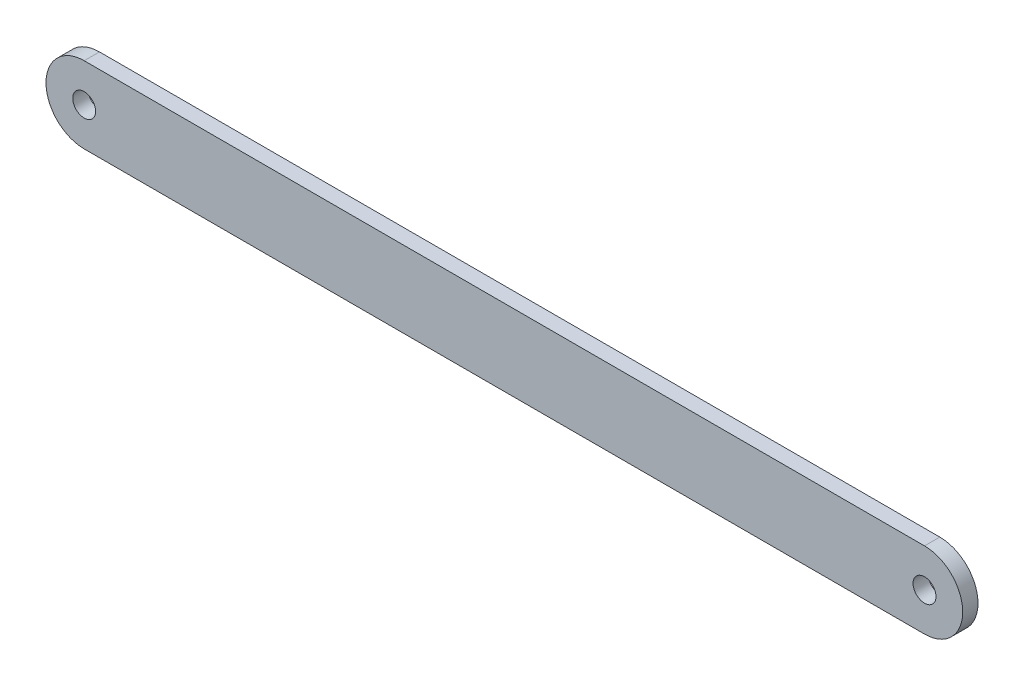
ISO-10303-21;
HEADER;
FILE_DESCRIPTION(('STEP AP214'),'2;1');
FILE_NAME('part.step','',(''),(''),'','','');
FILE_SCHEMA(('AUTOMOTIVE_DESIGN { 1 0 10303 214 1 1 1 1 }'));
ENDSEC;
DATA;
#1=APPLICATION_CONTEXT('core data for automotive mechanical design processes');
#2=APPLICATION_PROTOCOL_DEFINITION('international standard','automotive_design',2000,#1);
#3=PRODUCT_CONTEXT('',#1,'mechanical');
#4=PRODUCT('Part','Part','',(#3));
#5=PRODUCT_RELATED_PRODUCT_CATEGORY('part','',(#4));
#6=PRODUCT_DEFINITION_FORMATION('','',#4);
#7=PRODUCT_DEFINITION_CONTEXT('part definition',#1,'design');
#8=PRODUCT_DEFINITION('design','',#6,#7);
#9=PRODUCT_DEFINITION_SHAPE('','',#8);
#10=(LENGTH_UNIT() NAMED_UNIT(*) SI_UNIT(.MILLI.,.METRE.));
#11=(NAMED_UNIT(*) PLANE_ANGLE_UNIT() SI_UNIT($,.RADIAN.));
#12=(NAMED_UNIT(*) SI_UNIT($,.STERADIAN.) SOLID_ANGLE_UNIT());
#13=UNCERTAINTY_MEASURE_WITH_UNIT(LENGTH_MEASURE(1.E-05),#10,'distance_accuracy_value','');
#14=(GEOMETRIC_REPRESENTATION_CONTEXT(3) GLOBAL_UNCERTAINTY_ASSIGNED_CONTEXT((#13)) GLOBAL_UNIT_ASSIGNED_CONTEXT((#10,
#11,#12)) REPRESENTATION_CONTEXT('',''));
#15=CARTESIAN_POINT('',(0.,0.,0.));
#16=DIRECTION('',(0.,0.,1.));
#17=DIRECTION('',(1.,0.,0.));
#18=AXIS2_PLACEMENT_3D('',#15,#16,#17);
#19=CARTESIAN_POINT('',(9.73390781831E-06,1.23811E-11,2.));
#20=DIRECTION('',(0.,0.,1.));
#21=DIRECTION('',(1.,0.,0.));
#22=AXIS2_PLACEMENT_3D('',#19,#20,#21);
#23=PLANE('',#22);
#24=CARTESIAN_POINT('',(55.000017338002,0.,2.));
#25=DIRECTION('',(0.,0.,1.));
#26=DIRECTION('',(1.,0.,0.));
#27=AXIS2_PLACEMENT_3D('',#24,#25,#26);
#28=CIRCLE('',#27,1.5);
#29=CARTESIAN_POINT('',(56.500017338002,0.,2.));
#30=VERTEX_POINT('',#29);
#31=EDGE_CURVE('E25',#30,#30,#28,.T.);
#32=ORIENTED_EDGE('',*,*,#31,.F.);
#33=EDGE_LOOP('',(#32));
#34=FACE_BOUND('',#33,.T.);
#35=CARTESIAN_POINT('',(-55.,0.,2.));
#36=DIRECTION('',(0.,0.,1.));
#37=DIRECTION('',(1.,0.,0.));
#38=AXIS2_PLACEMENT_3D('',#35,#36,#37);
#39=CIRCLE('',#38,1.5);
#40=CARTESIAN_POINT('',(-53.5,0.,2.));
#41=VERTEX_POINT('',#40);
#42=EDGE_CURVE('E145',#41,#41,#39,.T.);
#43=ORIENTED_EDGE('',*,*,#42,.F.);
#44=EDGE_LOOP('',(#43));
#45=FACE_BOUND('',#44,.T.);
#46=CARTESIAN_POINT('',(55.000017338002,0.,2.));
#47=DIRECTION('',(0.,0.,1.));
#48=DIRECTION('',(1.,0.,0.));
#49=AXIS2_PLACEMENT_3D('',#46,#47,#48);
#50=CIRCLE('',#49,5.);
#51=CARTESIAN_POINT('',(55.000017289727,-4.999999999985,2.));
#52=VERTEX_POINT('',#51);
#53=CARTESIAN_POINT('',(55.000017289718,5.,2.));
#54=VERTEX_POINT('',#53);
#55=EDGE_CURVE('E112',#52,#54,#50,.T.);
#56=ORIENTED_EDGE('',*,*,#55,.T.);
#57=DIRECTION('',(1.,0.,0.));
#58=VECTOR('',#57,1.);
#59=CARTESIAN_POINT('',(-54.99998271028,5.,2.));
#60=LINE('',#59,#58);
#61=CARTESIAN_POINT('',(-54.99998271028,4.999999999985,2.));
#62=VERTEX_POINT('',#61);
#63=EDGE_CURVE('E95',#62,#54,#60,.T.);
#64=ORIENTED_EDGE('',*,*,#63,.F.);
#65=CARTESIAN_POINT('',(-55.,0.,2.));
#66=DIRECTION('',(0.,0.,1.));
#67=DIRECTION('',(1.,0.,0.));
#68=AXIS2_PLACEMENT_3D('',#65,#66,#67);
#69=CIRCLE('',#68,5.);
#70=CARTESIAN_POINT('',(-54.99998271027,-4.99999999997,2.));
#71=VERTEX_POINT('',#70);
#72=EDGE_CURVE('E72',#62,#71,#69,.T.);
#73=ORIENTED_EDGE('',*,*,#72,.T.);
#74=DIRECTION('',(1.,0.,0.));
#75=VECTOR('',#74,1.);
#76=CARTESIAN_POINT('',(-54.99998271027,-4.99999999997,2.));
#77=LINE('',#76,#75);
#78=EDGE_CURVE('E86',#71,#52,#77,.T.);
#79=ORIENTED_EDGE('',*,*,#78,.T.);
#80=EDGE_LOOP('',(#56,#64,#73,#79));
#81=FACE_BOUND('',#80,.T.);
#82=ADVANCED_FACE('F14',(#34,#45,#81),#23,.T.);
#83=CARTESIAN_POINT('',(9.73390781831E-06,1.23811E-11,0.));
#84=DIRECTION('',(0.,0.,1.));
#85=DIRECTION('',(1.,0.,0.));
#86=AXIS2_PLACEMENT_3D('',#83,#84,#85);
#87=PLANE('',#86);
#88=CARTESIAN_POINT('',(55.000017338002,0.,0.));
#89=DIRECTION('',(0.,0.,1.));
#90=DIRECTION('',(1.,0.,0.));
#91=AXIS2_PLACEMENT_3D('',#88,#89,#90);
#92=CIRCLE('',#91,1.5);
#93=CARTESIAN_POINT('',(56.500017338002,0.,0.));
#94=VERTEX_POINT('',#93);
#95=EDGE_CURVE('E9',#94,#94,#92,.T.);
#96=ORIENTED_EDGE('',*,*,#95,.T.);
#97=EDGE_LOOP('',(#96));
#98=FACE_BOUND('',#97,.T.);
#99=CARTESIAN_POINT('',(-55.,0.,0.));
#100=DIRECTION('',(0.,0.,1.));
#101=DIRECTION('',(1.,0.,0.));
#102=AXIS2_PLACEMENT_3D('',#99,#100,#101);
#103=CIRCLE('',#102,1.5);
#104=CARTESIAN_POINT('',(-53.5,0.,0.));
#105=VERTEX_POINT('',#104);
#106=EDGE_CURVE('E150',#105,#105,#103,.T.);
#107=ORIENTED_EDGE('',*,*,#106,.T.);
#108=EDGE_LOOP('',(#107));
#109=FACE_BOUND('',#108,.T.);
#110=DIRECTION('',(1.,0.,0.));
#111=VECTOR('',#110,1.);
#112=CARTESIAN_POINT('',(-54.99998271027,-4.99999999997,0.));
#113=LINE('',#112,#111);
#114=CARTESIAN_POINT('',(-54.99998271027,-4.99999999997,0.));
#115=VERTEX_POINT('',#114);
#116=CARTESIAN_POINT('',(55.000017289727,-4.999999999985,0.));
#117=VERTEX_POINT('',#116);
#118=EDGE_CURVE('E58',#115,#117,#113,.T.);
#119=ORIENTED_EDGE('',*,*,#118,.F.);
#120=CARTESIAN_POINT('',(-55.,0.,0.));
#121=DIRECTION('',(0.,0.,1.));
#122=DIRECTION('',(1.,0.,0.));
#123=AXIS2_PLACEMENT_3D('',#120,#121,#122);
#124=CIRCLE('',#123,5.);
#125=CARTESIAN_POINT('',(-54.99998271028,4.999999999985,0.));
#126=VERTEX_POINT('',#125);
#127=EDGE_CURVE('E18',#126,#115,#124,.T.);
#128=ORIENTED_EDGE('',*,*,#127,.F.);
#129=DIRECTION('',(1.,0.,0.));
#130=VECTOR('',#129,1.);
#131=CARTESIAN_POINT('',(-54.99998271028,5.,0.));
#132=LINE('',#131,#130);
#133=CARTESIAN_POINT('',(55.000017289718,5.,0.));
#134=VERTEX_POINT('',#133);
#135=EDGE_CURVE('E99',#126,#134,#132,.T.);
#136=ORIENTED_EDGE('',*,*,#135,.T.);
#137=CARTESIAN_POINT('',(55.000017338002,0.,0.));
#138=DIRECTION('',(0.,0.,1.));
#139=DIRECTION('',(1.,0.,0.));
#140=AXIS2_PLACEMENT_3D('',#137,#138,#139);
#141=CIRCLE('',#140,5.);
#142=EDGE_CURVE('E102',#117,#134,#141,.T.);
#143=ORIENTED_EDGE('',*,*,#142,.F.);
#144=EDGE_LOOP('',(#119,#128,#136,#143));
#145=FACE_BOUND('',#144,.T.);
#146=ADVANCED_FACE('F100',(#98,#109,#145),#87,.F.);
#147=CARTESIAN_POINT('',(55.000017338002,0.,0.));
#148=DIRECTION('',(0.,0.,-1.));
#149=DIRECTION('',(1.,0.,0.));
#150=AXIS2_PLACEMENT_3D('',#147,#148,#149);
#151=CYLINDRICAL_SURFACE('',#150,1.5);
#152=DIRECTION('',(0.,0.,1.));
#153=VECTOR('',#152,1.);
#154=CARTESIAN_POINT('',(56.500017338002,0.,0.));
#155=LINE('',#154,#153);
#156=EDGE_CURVE('E137',#94,#30,#155,.T.);
#157=ORIENTED_EDGE('',*,*,#156,.T.);
#158=ORIENTED_EDGE('',*,*,#31,.T.);
#159=ORIENTED_EDGE('',*,*,#156,.F.);
#160=ORIENTED_EDGE('',*,*,#95,.F.);
#161=EDGE_LOOP('',(#157,#158,#159,#160));
#162=FACE_BOUND('',#161,.T.);
#163=ADVANCED_FACE('F16',(#162),#151,.F.);
#164=CARTESIAN_POINT('',(-55.,0.,0.));
#165=DIRECTION('',(0.,0.,-1.));
#166=DIRECTION('',(1.,0.,0.));
#167=AXIS2_PLACEMENT_3D('',#164,#165,#166);
#168=CYLINDRICAL_SURFACE('',#167,1.5);
#169=DIRECTION('',(0.,0.,1.));
#170=VECTOR('',#169,1.);
#171=CARTESIAN_POINT('',(-53.5,0.,0.));
#172=LINE('',#171,#170);
#173=EDGE_CURVE('E141',#105,#41,#172,.T.);
#174=ORIENTED_EDGE('',*,*,#173,.T.);
#175=ORIENTED_EDGE('',*,*,#42,.T.);
#176=ORIENTED_EDGE('',*,*,#173,.F.);
#177=ORIENTED_EDGE('',*,*,#106,.F.);
#178=EDGE_LOOP('',(#174,#175,#176,#177));
#179=FACE_BOUND('',#178,.T.);
#180=ADVANCED_FACE('F178',(#179),#168,.F.);
#181=CARTESIAN_POINT('',(-54.99998271027,-4.99999999997,0.));
#182=DIRECTION('',(0.,1.,0.));
#183=DIRECTION('',(1.,0.,0.));
#184=AXIS2_PLACEMENT_3D('',#181,#182,#183);
#185=PLANE('',#184);
#186=ORIENTED_EDGE('',*,*,#118,.T.);
#187=DIRECTION('',(0.,0.,1.));
#188=VECTOR('',#187,1.);
#189=CARTESIAN_POINT('',(55.000017289727,-4.999999999985,0.));
#190=LINE('',#189,#188);
#191=EDGE_CURVE('E115',#117,#52,#190,.T.);
#192=ORIENTED_EDGE('',*,*,#191,.T.);
#193=ORIENTED_EDGE('',*,*,#78,.F.);
#194=DIRECTION('',(0.,0.,1.));
#195=VECTOR('',#194,1.);
#196=CARTESIAN_POINT('',(-54.99998271027,-4.99999999997,0.));
#197=LINE('',#196,#195);
#198=EDGE_CURVE('E140',#115,#71,#197,.T.);
#199=ORIENTED_EDGE('',*,*,#198,.F.);
#200=EDGE_LOOP('',(#186,#192,#193,#199));
#201=FACE_BOUND('',#200,.T.);
#202=ADVANCED_FACE('F169',(#201),#185,.F.);
#203=CARTESIAN_POINT('',(-55.,0.,0.));
#204=DIRECTION('',(0.,0.,-1.));
#205=DIRECTION('',(1.,0.,0.));
#206=AXIS2_PLACEMENT_3D('',#203,#204,#205);
#207=CYLINDRICAL_SURFACE('',#206,5.);
#208=ORIENTED_EDGE('',*,*,#127,.T.);
#209=ORIENTED_EDGE('',*,*,#198,.T.);
#210=ORIENTED_EDGE('',*,*,#72,.F.);
#211=DIRECTION('',(0.,0.,1.));
#212=VECTOR('',#211,1.);
#213=CARTESIAN_POINT('',(-54.99998271028,4.999999999985,0.));
#214=LINE('',#213,#212);
#215=EDGE_CURVE('E128',#126,#62,#214,.T.);
#216=ORIENTED_EDGE('',*,*,#215,.F.);
#217=EDGE_LOOP('',(#208,#209,#210,#216));
#218=FACE_BOUND('',#217,.T.);
#219=ADVANCED_FACE('F167',(#218),#207,.T.);
#220=CARTESIAN_POINT('',(-54.99998271028,5.,0.));
#221=DIRECTION('',(0.,1.,0.));
#222=DIRECTION('',(1.,0.,0.));
#223=AXIS2_PLACEMENT_3D('',#220,#221,#222);
#224=PLANE('',#223);
#225=ORIENTED_EDGE('',*,*,#215,.T.);
#226=ORIENTED_EDGE('',*,*,#63,.T.);
#227=DIRECTION('',(0.,0.,1.));
#228=VECTOR('',#227,1.);
#229=CARTESIAN_POINT('',(55.000017289718,5.,0.));
#230=LINE('',#229,#228);
#231=EDGE_CURVE('E107',#134,#54,#230,.T.);
#232=ORIENTED_EDGE('',*,*,#231,.F.);
#233=ORIENTED_EDGE('',*,*,#135,.F.);
#234=EDGE_LOOP('',(#225,#226,#232,#233));
#235=FACE_BOUND('',#234,.T.);
#236=ADVANCED_FACE('F108',(#235),#224,.T.);
#237=CARTESIAN_POINT('',(55.000017338002,0.,0.));
#238=DIRECTION('',(0.,0.,-1.));
#239=DIRECTION('',(1.,0.,0.));
#240=AXIS2_PLACEMENT_3D('',#237,#238,#239);
#241=CYLINDRICAL_SURFACE('',#240,5.);
#242=ORIENTED_EDGE('',*,*,#142,.T.);
#243=ORIENTED_EDGE('',*,*,#231,.T.);
#244=ORIENTED_EDGE('',*,*,#55,.F.);
#245=ORIENTED_EDGE('',*,*,#191,.F.);
#246=EDGE_LOOP('',(#242,#243,#244,#245));
#247=FACE_BOUND('',#246,.T.);
#248=ADVANCED_FACE('F114',(#247),#241,.T.);
#249=CLOSED_SHELL('',(#82,#146,#163,#180,#202,#219,#236,#248));
#250=MANIFOLD_SOLID_BREP('B1',#249);
#251=ADVANCED_BREP_SHAPE_REPRESENTATION('',(#18,#250),#14);
#252=SHAPE_DEFINITION_REPRESENTATION(#9,#251);
ENDSEC;
END-ISO-10303-21;
